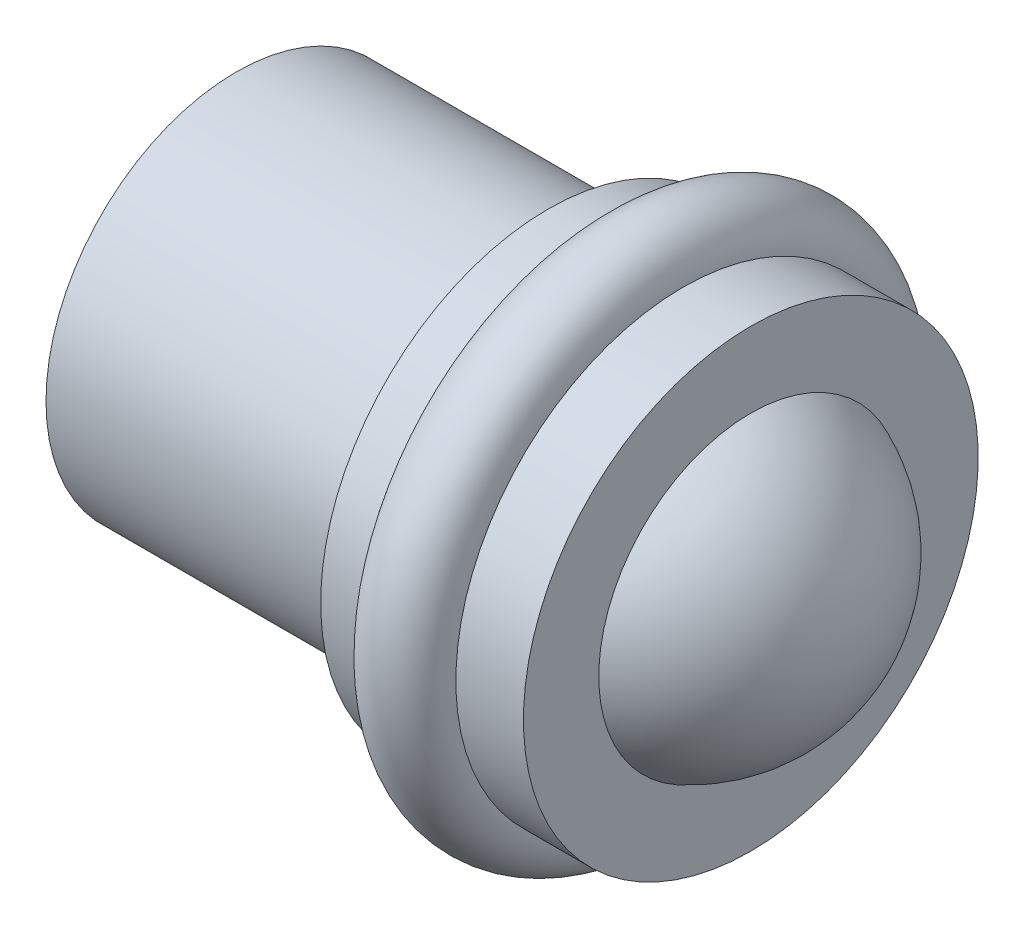
ISO-10303-21;
HEADER;
FILE_DESCRIPTION(('STEP AP214'),'2;1');
FILE_NAME('part.step','',(''),(''),'','','');
FILE_SCHEMA(('AUTOMOTIVE_DESIGN { 1 0 10303 214 1 1 1 1 }'));
ENDSEC;
DATA;
#1=APPLICATION_CONTEXT('core data for automotive mechanical design processes');
#2=APPLICATION_PROTOCOL_DEFINITION('international standard','automotive_design',2000,#1);
#3=PRODUCT_CONTEXT('',#1,'mechanical');
#4=PRODUCT('Part','Part','',(#3));
#5=PRODUCT_RELATED_PRODUCT_CATEGORY('part','',(#4));
#6=PRODUCT_DEFINITION_FORMATION('','',#4);
#7=PRODUCT_DEFINITION_CONTEXT('part definition',#1,'design');
#8=PRODUCT_DEFINITION('design','',#6,#7);
#9=PRODUCT_DEFINITION_SHAPE('','',#8);
#10=(LENGTH_UNIT() NAMED_UNIT(*) SI_UNIT(.MILLI.,.METRE.));
#11=(NAMED_UNIT(*) PLANE_ANGLE_UNIT() SI_UNIT($,.RADIAN.));
#12=(NAMED_UNIT(*) SI_UNIT($,.STERADIAN.) SOLID_ANGLE_UNIT());
#13=UNCERTAINTY_MEASURE_WITH_UNIT(LENGTH_MEASURE(1.E-05),#10,'distance_accuracy_value','');
#14=(GEOMETRIC_REPRESENTATION_CONTEXT(3) GLOBAL_UNCERTAINTY_ASSIGNED_CONTEXT((#13)) GLOBAL_UNIT_ASSIGNED_CONTEXT((#10,
#11,#12)) REPRESENTATION_CONTEXT('',''));
#15=CARTESIAN_POINT('',(0.,0.,0.));
#16=DIRECTION('',(0.,0.,1.));
#17=DIRECTION('',(1.,0.,0.));
#18=AXIS2_PLACEMENT_3D('',#15,#16,#17);
#19=CARTESIAN_POINT('',(2.53365,0.,0.));
#20=DIRECTION('',(-1.,0.,0.));
#21=DIRECTION('',(0.,-1.,0.));
#22=AXIS2_PLACEMENT_3D('',#19,#20,#21);
#23=TOROIDAL_SURFACE('',#22,5.9817,1.11125);
#24=CARTESIAN_POINT('',(2.53365,-7.09295,0.));
#25=VERTEX_POINT('',#24);
#26=VERTEX_LOOP('',#25);
#27=FACE_BOUND('',#26,.T.);
#28=ADVANCED_FACE('F42',(#27),#23,.T.);
#29=CLOSED_SHELL('',(#28));
#30=MANIFOLD_SOLID_BREP('B2',#29);
#31=CARTESIAN_POINT('',(-8.1153,0.,0.));
#32=DIRECTION('',(1.,0.,0.));
#33=DIRECTION('',(0.,1.,0.));
#34=AXIS2_PLACEMENT_3D('',#31,#32,#33);
#35=PLANE('',#34);
#36=CARTESIAN_POINT('',(-8.1153,0.,0.));
#37=DIRECTION('',(-1.,0.,0.));
#38=DIRECTION('',(0.,-1.,0.));
#39=AXIS2_PLACEMENT_3D('',#36,#37,#38);
#40=CIRCLE('',#39,5.0038);
#41=CARTESIAN_POINT('',(-8.1153,-5.0038,0.));
#42=VERTEX_POINT('',#41);
#43=EDGE_CURVE('E41',#42,#42,#40,.T.);
#44=ORIENTED_EDGE('',*,*,#43,.T.);
#45=EDGE_LOOP('',(#44));
#46=FACE_BOUND('',#45,.T.);
#47=ADVANCED_FACE('F54',(#46),#35,.F.);
#48=CARTESIAN_POINT('',(-8.1153,0.,0.));
#49=DIRECTION('',(-1.,0.,0.));
#50=DIRECTION('',(0.,-1.,0.));
#51=AXIS2_PLACEMENT_3D('',#48,#49,#50);
#52=CYLINDRICAL_SURFACE('',#51,5.0038);
#53=ORIENTED_EDGE('',*,*,#43,.F.);
#54=EDGE_LOOP('',(#53));
#55=FACE_BOUND('',#54,.T.);
#56=CARTESIAN_POINT('',(0.0888999999999977,0.,0.));
#57=DIRECTION('',(-1.,0.,0.));
#58=DIRECTION('',(0.,-1.,0.));
#59=AXIS2_PLACEMENT_3D('',#56,#57,#58);
#60=CIRCLE('',#59,5.0038);
#61=CARTESIAN_POINT('',(0.0888999999999977,-5.0038,0.));
#62=VERTEX_POINT('',#61);
#63=EDGE_CURVE('E60',#62,#62,#60,.T.);
#64=ORIENTED_EDGE('',*,*,#63,.T.);
#65=EDGE_LOOP('',(#64));
#66=FACE_BOUND('',#65,.T.);
#67=ADVANCED_FACE('F95',(#55,#66),#52,.T.);
#68=CARTESIAN_POINT('',(0.0888999999999993,5.0038,0.));
#69=DIRECTION('',(1.,0.,0.));
#70=DIRECTION('',(0.,1.,0.));
#71=AXIS2_PLACEMENT_3D('',#68,#69,#70);
#72=PLANE('',#71);
#73=ORIENTED_EDGE('',*,*,#63,.F.);
#74=EDGE_LOOP('',(#73));
#75=FACE_BOUND('',#74,.T.);
#76=CARTESIAN_POINT('',(0.0888999999999994,0.,0.));
#77=DIRECTION('',(-1.,0.,0.));
#78=DIRECTION('',(0.,-1.,0.));
#79=AXIS2_PLACEMENT_3D('',#76,#77,#78);
#80=CIRCLE('',#79,5.9817);
#81=CARTESIAN_POINT('',(0.0888999999999994,-5.9817,0.));
#82=VERTEX_POINT('',#81);
#83=EDGE_CURVE('E64',#82,#82,#80,.T.);
#84=ORIENTED_EDGE('',*,*,#83,.T.);
#85=EDGE_LOOP('',(#84));
#86=FACE_BOUND('',#85,.T.);
#87=ADVANCED_FACE('F99',(#75,#86),#72,.F.);
#88=CARTESIAN_POINT('',(-8.1153,0.,0.));
#89=DIRECTION('',(-1.,0.,0.));
#90=DIRECTION('',(0.,-1.,0.));
#91=AXIS2_PLACEMENT_3D('',#88,#89,#90);
#92=CYLINDRICAL_SURFACE('',#91,5.9817);
#93=ORIENTED_EDGE('',*,*,#83,.F.);
#94=EDGE_LOOP('',(#93));
#95=FACE_BOUND('',#94,.T.);
#96=CARTESIAN_POINT('',(1.4224,0.,0.));
#97=DIRECTION('',(-1.,0.,0.));
#98=DIRECTION('',(0.,-1.,0.));
#99=AXIS2_PLACEMENT_3D('',#96,#97,#98);
#100=CIRCLE('',#99,5.9817);
#101=CARTESIAN_POINT('',(1.4224,-5.9817,0.));
#102=VERTEX_POINT('',#101);
#103=EDGE_CURVE('E68',#102,#102,#100,.T.);
#104=ORIENTED_EDGE('',*,*,#103,.T.);
#105=EDGE_LOOP('',(#104));
#106=FACE_BOUND('',#105,.T.);
#107=ADVANCED_FACE('F104',(#95,#106),#92,.T.);
#108=CARTESIAN_POINT('',(2.53365,0.,0.));
#109=DIRECTION('',(-1.,0.,0.));
#110=DIRECTION('',(0.,-1.,0.));
#111=AXIS2_PLACEMENT_3D('',#108,#109,#110);
#112=TOROIDAL_SURFACE('',#111,5.9817,1.11125);
#113=ORIENTED_EDGE('',*,*,#103,.F.);
#114=EDGE_LOOP('',(#113));
#115=FACE_BOUND('',#114,.T.);
#116=CARTESIAN_POINT('',(3.6449,0.,0.));
#117=DIRECTION('',(-1.,0.,0.));
#118=DIRECTION('',(0.,-1.,0.));
#119=AXIS2_PLACEMENT_3D('',#116,#117,#118);
#120=CIRCLE('',#119,5.9817);
#121=CARTESIAN_POINT('',(3.6449,-5.9817,0.));
#122=VERTEX_POINT('',#121);
#123=EDGE_CURVE('E73',#122,#122,#120,.T.);
#124=ORIENTED_EDGE('',*,*,#123,.T.);
#125=EDGE_LOOP('',(#124));
#126=FACE_BOUND('',#125,.T.);
#127=ADVANCED_FACE('F110',(#115,#126),#112,.F.);
#128=CARTESIAN_POINT('',(-8.1153,0.,0.));
#129=DIRECTION('',(-1.,0.,0.));
#130=DIRECTION('',(0.,-1.,0.));
#131=AXIS2_PLACEMENT_3D('',#128,#129,#130);
#132=CYLINDRICAL_SURFACE('',#131,5.9817);
#133=ORIENTED_EDGE('',*,*,#123,.F.);
#134=EDGE_LOOP('',(#133));
#135=FACE_BOUND('',#134,.T.);
#136=CARTESIAN_POINT('',(5.4229,0.,0.));
#137=DIRECTION('',(-1.,0.,0.));
#138=DIRECTION('',(0.,-1.,0.));
#139=AXIS2_PLACEMENT_3D('',#136,#137,#138);
#140=CIRCLE('',#139,5.9817);
#141=CARTESIAN_POINT('',(5.4229,-5.9817,0.));
#142=VERTEX_POINT('',#141);
#143=EDGE_CURVE('E76',#142,#142,#140,.T.);
#144=ORIENTED_EDGE('',*,*,#143,.T.);
#145=EDGE_LOOP('',(#144));
#146=FACE_BOUND('',#145,.T.);
#147=ADVANCED_FACE('F91',(#135,#146),#132,.T.);
#148=CARTESIAN_POINT('',(5.4229,5.9817,0.));
#149=DIRECTION('',(-1.,0.,0.));
#150=DIRECTION('',(0.,-1.,0.));
#151=AXIS2_PLACEMENT_3D('',#148,#149,#150);
#152=PLANE('',#151);
#153=ORIENTED_EDGE('',*,*,#143,.F.);
#154=EDGE_LOOP('',(#153));
#155=FACE_BOUND('',#154,.T.);
#156=CARTESIAN_POINT('',(5.4229,0.,0.));
#157=DIRECTION('',(-1.,0.,0.));
#158=DIRECTION('',(0.,-1.,0.));
#159=AXIS2_PLACEMENT_3D('',#156,#157,#158);
#160=CIRCLE('',#159,4.0005);
#161=CARTESIAN_POINT('',(5.4229,-4.0005,0.));
#162=VERTEX_POINT('',#161);
#163=EDGE_CURVE('E79',#162,#162,#160,.T.);
#164=ORIENTED_EDGE('',*,*,#163,.T.);
#165=EDGE_LOOP('',(#164));
#166=FACE_BOUND('',#165,.T.);
#167=ADVANCED_FACE('F83',(#155,#166),#152,.F.);
#168=CARTESIAN_POINT('',(3.7970304245283,0.,0.));
#169=DIRECTION('',(-1.,0.,0.));
#170=DIRECTION('',(0.,1.,0.));
#171=AXIS2_PLACEMENT_3D('',#168,#169,#170);
#172=SPHERICAL_SURFACE('',#171,4.3182695754717);
#173=ORIENTED_EDGE('',*,*,#163,.F.);
#174=EDGE_LOOP('',(#173));
#175=FACE_BOUND('',#174,.T.);
#176=ADVANCED_FACE('F85',(#175),#172,.T.);
#177=CLOSED_SHELL('',(#47,#67,#87,#107,#127,#147,#167,#176));
#178=MANIFOLD_SOLID_BREP('B6',#177);
#179=ADVANCED_BREP_SHAPE_REPRESENTATION('',(#18,#30,#178),#14);
#180=SHAPE_DEFINITION_REPRESENTATION(#9,#179);
ENDSEC;
END-ISO-10303-21;
